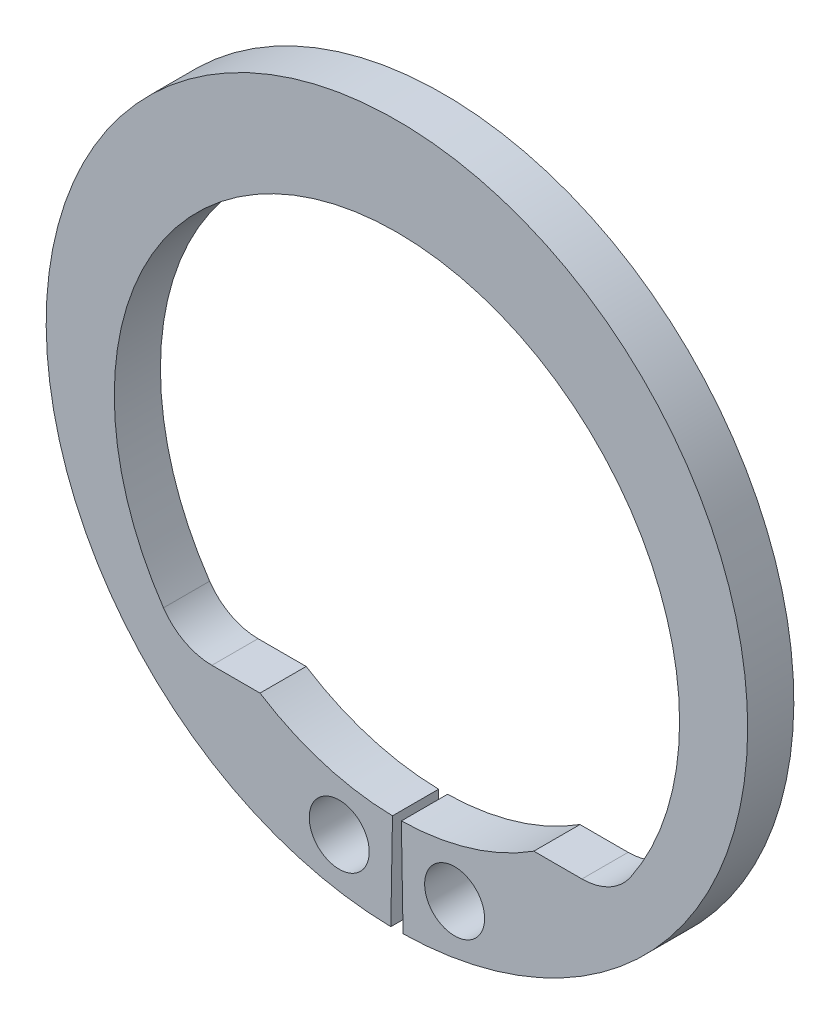
ISO-10303-21;
HEADER;
FILE_DESCRIPTION(('STEP AP214'),'2;1');
FILE_NAME('part.step','',(''),(''),'','','');
FILE_SCHEMA(('AUTOMOTIVE_DESIGN { 1 0 10303 214 1 1 1 1 }'));
ENDSEC;
DATA;
#1=APPLICATION_CONTEXT('core data for automotive mechanical design processes');
#2=APPLICATION_PROTOCOL_DEFINITION('international standard','automotive_design',2000,#1);
#3=PRODUCT_CONTEXT('',#1,'mechanical');
#4=PRODUCT('Part','Part','',(#3));
#5=PRODUCT_RELATED_PRODUCT_CATEGORY('part','',(#4));
#6=PRODUCT_DEFINITION_FORMATION('','',#4);
#7=PRODUCT_DEFINITION_CONTEXT('part definition',#1,'design');
#8=PRODUCT_DEFINITION('design','',#6,#7);
#9=PRODUCT_DEFINITION_SHAPE('','',#8);
#10=(LENGTH_UNIT() NAMED_UNIT(*) SI_UNIT(.MILLI.,.METRE.));
#11=(NAMED_UNIT(*) PLANE_ANGLE_UNIT() SI_UNIT($,.RADIAN.));
#12=(NAMED_UNIT(*) SI_UNIT($,.STERADIAN.) SOLID_ANGLE_UNIT());
#13=UNCERTAINTY_MEASURE_WITH_UNIT(LENGTH_MEASURE(1.E-05),#10,'distance_accuracy_value','');
#14=(GEOMETRIC_REPRESENTATION_CONTEXT(3) GLOBAL_UNCERTAINTY_ASSIGNED_CONTEXT((#13)) GLOBAL_UNIT_ASSIGNED_CONTEXT((#10,
#11,#12)) REPRESENTATION_CONTEXT('',''));
#15=CARTESIAN_POINT('',(0.,0.,0.));
#16=DIRECTION('',(0.,0.,1.));
#17=DIRECTION('',(1.,0.,0.));
#18=AXIS2_PLACEMENT_3D('',#15,#16,#17);
#19=CARTESIAN_POINT('',(0.,0.,0.5));
#20=DIRECTION('',(0.,0.,1.));
#21=DIRECTION('',(1.,0.,0.));
#22=AXIS2_PLACEMENT_3D('',#19,#20,#21);
#23=PLANE('',#22);
#24=CARTESIAN_POINT('',(0.,0.,0.5));
#25=DIRECTION('',(0.,0.,-1.));
#26=DIRECTION('',(1.,0.,0.));
#27=AXIS2_PLACEMENT_3D('',#24,#25,#26);
#28=CIRCLE('',#27,5.5);
#29=CARTESIAN_POINT('',(-0.0959882354050588,-5.49916232336015,0.5));
#30=VERTEX_POINT('',#29);
#31=CARTESIAN_POINT('',(-2.96626869989887,-4.63154941677191,0.5));
#32=VERTEX_POINT('',#31);
#33=EDGE_CURVE('E170',#30,#32,#28,.T.);
#34=ORIENTED_EDGE('',*,*,#33,.T.);
#35=DIRECTION('',(-1.,0.,0.));
#36=VECTOR('',#35,1.);
#37=CARTESIAN_POINT('',(-2.96626869989887,-4.63154941677191,0.5));
#38=LINE('',#37,#36);
#39=CARTESIAN_POINT('',(-4.00916176916149,-4.63154941677191,0.5));
#40=VERTEX_POINT('',#39);
#41=EDGE_CURVE('E172',#32,#40,#38,.T.);
#42=ORIENTED_EDGE('',*,*,#41,.T.);
#43=CARTESIAN_POINT('',(-4.00916176916149,-3.36154941677191,0.5));
#44=DIRECTION('',(0.,0.,1.));
#45=DIRECTION('',(1.,0.,0.));
#46=AXIS2_PLACEMENT_3D('',#43,#44,#45);
#47=CIRCLE('',#46,1.27);
#48=CARTESIAN_POINT('',(-5.05802960097574,-4.07763340024401,0.5));
#49=VERTEX_POINT('',#48);
#50=EDGE_CURVE('E11',#40,#49,#47,.F.);
#51=ORIENTED_EDGE('',*,*,#50,.T.);
#52=CARTESIAN_POINT('',(0.,-0.624410910884708,0.5));
#53=DIRECTION('',(0.,0.,-1.));
#54=DIRECTION('',(-1.,0.,0.));
#55=AXIS2_PLACEMENT_3D('',#52,#53,#54);
#56=CIRCLE('',#55,6.12441091088471);
#57=CARTESIAN_POINT('',(5.05802960097574,-4.07763340024401,0.5));
#58=VERTEX_POINT('',#57);
#59=EDGE_CURVE('E175',#49,#58,#56,.T.);
#60=ORIENTED_EDGE('',*,*,#59,.T.);
#61=CARTESIAN_POINT('',(4.00916176916149,-3.36154941677191,0.5));
#62=DIRECTION('',(0.,0.,-1.));
#63=DIRECTION('',(-1.,0.,0.));
#64=AXIS2_PLACEMENT_3D('',#61,#62,#63);
#65=CIRCLE('',#64,1.27);
#66=CARTESIAN_POINT('',(4.00916176916149,-4.63154941677191,0.5));
#67=VERTEX_POINT('',#66);
#68=EDGE_CURVE('E133',#67,#58,#65,.F.);
#69=ORIENTED_EDGE('',*,*,#68,.F.);
#70=DIRECTION('',(1.,0.,0.));
#71=VECTOR('',#70,1.);
#72=CARTESIAN_POINT('',(2.96626869989887,-4.63154941677191,0.5));
#73=LINE('',#72,#71);
#74=CARTESIAN_POINT('',(2.96626869989887,-4.63154941677191,0.5));
#75=VERTEX_POINT('',#74);
#76=EDGE_CURVE('E115',#75,#67,#73,.T.);
#77=ORIENTED_EDGE('',*,*,#76,.F.);
#78=CARTESIAN_POINT('',(0.,0.,0.5));
#79=DIRECTION('',(0.,0.,1.));
#80=DIRECTION('',(-1.,0.,0.));
#81=AXIS2_PLACEMENT_3D('',#78,#79,#80);
#82=CIRCLE('',#81,5.5);
#83=CARTESIAN_POINT('',(0.0959882354050588,-5.49916232336015,0.5));
#84=VERTEX_POINT('',#83);
#85=EDGE_CURVE('E131',#84,#75,#82,.T.);
#86=ORIENTED_EDGE('',*,*,#85,.F.);
#87=DIRECTION('',(-0.0174524064372834,0.999847695156391,0.));
#88=VECTOR('',#87,1.);
#89=CARTESIAN_POINT('',(0.0959882354050588,-5.49916232336015,0.5));
#90=LINE('',#89,#88);
#91=CARTESIAN_POINT('',(0.132638288923355,-7.59884248318857,0.5));
#92=VERTEX_POINT('',#91);
#93=EDGE_CURVE('E134',#92,#84,#90,.T.);
#94=ORIENTED_EDGE('',*,*,#93,.F.);
#95=CARTESIAN_POINT('',(0.,0.,0.5));
#96=DIRECTION('',(0.,0.,1.));
#97=DIRECTION('',(1.,0.,0.));
#98=AXIS2_PLACEMENT_3D('',#95,#96,#97);
#99=CIRCLE('',#98,7.6);
#100=CARTESIAN_POINT('',(-0.132638288923355,-7.59884248318857,0.5));
#101=VERTEX_POINT('',#100);
#102=EDGE_CURVE('E177',#92,#101,#99,.T.);
#103=ORIENTED_EDGE('',*,*,#102,.T.);
#104=DIRECTION('',(0.0174524064372834,0.999847695156391,0.));
#105=VECTOR('',#104,1.);
#106=CARTESIAN_POINT('',(-0.0959882354050588,-5.49916232336015,0.5));
#107=LINE('',#106,#105);
#108=EDGE_CURVE('E179',#101,#30,#107,.T.);
#109=ORIENTED_EDGE('',*,*,#108,.T.);
#110=EDGE_LOOP('',(#34,#42,#51,#60,#69,#77,#86,#94,#103,#109));
#111=FACE_BOUND('',#110,.T.);
#112=CARTESIAN_POINT('',(-1.24979891971637,-6.4296580515822,0.5));
#113=DIRECTION('',(0.,0.,1.));
#114=DIRECTION('',(1.,0.,0.));
#115=AXIS2_PLACEMENT_3D('',#112,#113,#114);
#116=CIRCLE('',#115,0.65);
#117=CARTESIAN_POINT('',(-0.59979891971637,-6.4296580515822,0.5));
#118=VERTEX_POINT('',#117);
#119=EDGE_CURVE('E164',#118,#118,#116,.T.);
#120=ORIENTED_EDGE('',*,*,#119,.F.);
#121=EDGE_LOOP('',(#120));
#122=FACE_BOUND('',#121,.T.);
#123=CARTESIAN_POINT('',(1.24979891971637,-6.4296580515822,0.5));
#124=DIRECTION('',(0.,0.,-1.));
#125=DIRECTION('',(-1.,0.,0.));
#126=AXIS2_PLACEMENT_3D('',#123,#124,#125);
#127=CIRCLE('',#126,0.65);
#128=CARTESIAN_POINT('',(0.59979891971637,-6.4296580515822,0.5));
#129=VERTEX_POINT('',#128);
#130=EDGE_CURVE('E150',#129,#129,#127,.T.);
#131=ORIENTED_EDGE('',*,*,#130,.T.);
#132=EDGE_LOOP('',(#131));
#133=FACE_BOUND('',#132,.T.);
#134=ADVANCED_FACE('F37',(#111,#122,#133),#23,.T.);
#135=CARTESIAN_POINT('',(0.,0.,-0.5));
#136=DIRECTION('',(0.,0.,1.));
#137=DIRECTION('',(1.,0.,0.));
#138=AXIS2_PLACEMENT_3D('',#135,#136,#137);
#139=PLANE('',#138);
#140=CARTESIAN_POINT('',(0.,0.,-0.5));
#141=DIRECTION('',(0.,0.,-1.));
#142=DIRECTION('',(1.,0.,0.));
#143=AXIS2_PLACEMENT_3D('',#140,#141,#142);
#144=CIRCLE('',#143,5.5);
#145=CARTESIAN_POINT('',(-0.0959882354050588,-5.49916232336015,-0.5));
#146=VERTEX_POINT('',#145);
#147=CARTESIAN_POINT('',(-2.96626869989887,-4.63154941677191,-0.5));
#148=VERTEX_POINT('',#147);
#149=EDGE_CURVE('E167',#146,#148,#144,.T.);
#150=ORIENTED_EDGE('',*,*,#149,.F.);
#151=DIRECTION('',(0.0174524064372834,0.999847695156391,0.));
#152=VECTOR('',#151,1.);
#153=CARTESIAN_POINT('',(-0.0959882354050588,-5.49916232336015,-0.5));
#154=LINE('',#153,#152);
#155=CARTESIAN_POINT('',(-0.132638288923355,-7.59884248318857,-0.5));
#156=VERTEX_POINT('',#155);
#157=EDGE_CURVE('E173',#156,#146,#154,.T.);
#158=ORIENTED_EDGE('',*,*,#157,.F.);
#159=CARTESIAN_POINT('',(0.,0.,-0.5));
#160=DIRECTION('',(0.,0.,1.));
#161=DIRECTION('',(1.,0.,0.));
#162=AXIS2_PLACEMENT_3D('',#159,#160,#161);
#163=CIRCLE('',#162,7.6);
#164=CARTESIAN_POINT('',(0.132638288923355,-7.59884248318857,-0.5));
#165=VERTEX_POINT('',#164);
#166=EDGE_CURVE('E188',#165,#156,#163,.T.);
#167=ORIENTED_EDGE('',*,*,#166,.F.);
#168=DIRECTION('',(-0.0174524064372834,0.999847695156391,0.));
#169=VECTOR('',#168,1.);
#170=CARTESIAN_POINT('',(0.0959882354050588,-5.49916232336015,-0.5));
#171=LINE('',#170,#169);
#172=CARTESIAN_POINT('',(0.0959882354050588,-5.49916232336015,-0.5));
#173=VERTEX_POINT('',#172);
#174=EDGE_CURVE('E139',#165,#173,#171,.T.);
#175=ORIENTED_EDGE('',*,*,#174,.T.);
#176=CARTESIAN_POINT('',(0.,0.,-0.5));
#177=DIRECTION('',(0.,0.,1.));
#178=DIRECTION('',(-1.,0.,0.));
#179=AXIS2_PLACEMENT_3D('',#176,#177,#178);
#180=CIRCLE('',#179,5.5);
#181=CARTESIAN_POINT('',(2.96626869989887,-4.63154941677191,-0.5));
#182=VERTEX_POINT('',#181);
#183=EDGE_CURVE('E148',#173,#182,#180,.T.);
#184=ORIENTED_EDGE('',*,*,#183,.T.);
#185=DIRECTION('',(1.,0.,0.));
#186=VECTOR('',#185,1.);
#187=CARTESIAN_POINT('',(2.96626869989887,-4.63154941677191,-0.5));
#188=LINE('',#187,#186);
#189=CARTESIAN_POINT('',(4.00916176916149,-4.63154941677191,-0.5));
#190=VERTEX_POINT('',#189);
#191=EDGE_CURVE('E118',#182,#190,#188,.T.);
#192=ORIENTED_EDGE('',*,*,#191,.T.);
#193=CARTESIAN_POINT('',(4.00916176916149,-3.36154941677191,-0.5));
#194=DIRECTION('',(0.,0.,-1.));
#195=DIRECTION('',(-1.,0.,0.));
#196=AXIS2_PLACEMENT_3D('',#193,#194,#195);
#197=CIRCLE('',#196,1.27);
#198=CARTESIAN_POINT('',(5.05802960097574,-4.07763340024401,-0.5));
#199=VERTEX_POINT('',#198);
#200=EDGE_CURVE('E159',#199,#190,#197,.T.);
#201=ORIENTED_EDGE('',*,*,#200,.F.);
#202=CARTESIAN_POINT('',(0.,-0.624410910884708,-0.5));
#203=DIRECTION('',(0.,0.,-1.));
#204=DIRECTION('',(-1.,0.,0.));
#205=AXIS2_PLACEMENT_3D('',#202,#203,#204);
#206=CIRCLE('',#205,6.12441091088471);
#207=CARTESIAN_POINT('',(-5.05802960097574,-4.07763340024401,-0.5));
#208=VERTEX_POINT('',#207);
#209=EDGE_CURVE('E186',#208,#199,#206,.T.);
#210=ORIENTED_EDGE('',*,*,#209,.F.);
#211=CARTESIAN_POINT('',(-4.00916176916149,-3.36154941677191,-0.5));
#212=DIRECTION('',(0.,0.,1.));
#213=DIRECTION('',(1.,0.,0.));
#214=AXIS2_PLACEMENT_3D('',#211,#212,#213);
#215=CIRCLE('',#214,1.27);
#216=CARTESIAN_POINT('',(-4.00916176916149,-4.63154941677191,-0.5));
#217=VERTEX_POINT('',#216);
#218=EDGE_CURVE('E45',#208,#217,#215,.T.);
#219=ORIENTED_EDGE('',*,*,#218,.T.);
#220=DIRECTION('',(-1.,0.,0.));
#221=VECTOR('',#220,1.);
#222=CARTESIAN_POINT('',(-2.96626869989887,-4.63154941677191,-0.5));
#223=LINE('',#222,#221);
#224=EDGE_CURVE('E184',#148,#217,#223,.T.);
#225=ORIENTED_EDGE('',*,*,#224,.F.);
#226=EDGE_LOOP('',(#150,#158,#167,#175,#184,#192,#201,#210,#219,#225));
#227=FACE_BOUND('',#226,.T.);
#228=CARTESIAN_POINT('',(-1.24979891971637,-6.4296580515822,-0.5));
#229=DIRECTION('',(0.,0.,1.));
#230=DIRECTION('',(1.,0.,0.));
#231=AXIS2_PLACEMENT_3D('',#228,#229,#230);
#232=CIRCLE('',#231,0.65);
#233=CARTESIAN_POINT('',(-0.59979891971637,-6.4296580515822,-0.5));
#234=VERTEX_POINT('',#233);
#235=EDGE_CURVE('E163',#234,#234,#232,.T.);
#236=ORIENTED_EDGE('',*,*,#235,.T.);
#237=EDGE_LOOP('',(#236));
#238=FACE_BOUND('',#237,.T.);
#239=CARTESIAN_POINT('',(1.24979891971637,-6.4296580515822,-0.5));
#240=DIRECTION('',(0.,0.,-1.));
#241=DIRECTION('',(-1.,0.,0.));
#242=AXIS2_PLACEMENT_3D('',#239,#240,#241);
#243=CIRCLE('',#242,0.65);
#244=CARTESIAN_POINT('',(0.59979891971637,-6.4296580515822,-0.5));
#245=VERTEX_POINT('',#244);
#246=EDGE_CURVE('E144',#245,#245,#243,.T.);
#247=ORIENTED_EDGE('',*,*,#246,.F.);
#248=EDGE_LOOP('',(#247));
#249=FACE_BOUND('',#248,.T.);
#250=ADVANCED_FACE('F211',(#227,#238,#249),#139,.F.);
#251=CARTESIAN_POINT('',(0.,0.,0.5));
#252=DIRECTION('',(0.,0.,-1.));
#253=DIRECTION('',(-1.,0.,0.));
#254=AXIS2_PLACEMENT_3D('',#251,#252,#253);
#255=CYLINDRICAL_SURFACE('',#254,5.5);
#256=ORIENTED_EDGE('',*,*,#149,.T.);
#257=DIRECTION('',(0.,0.,-1.));
#258=VECTOR('',#257,1.);
#259=CARTESIAN_POINT('',(-2.96626869989887,-4.63154941677191,0.5));
#260=LINE('',#259,#258);
#261=EDGE_CURVE('E196',#32,#148,#260,.T.);
#262=ORIENTED_EDGE('',*,*,#261,.F.);
#263=ORIENTED_EDGE('',*,*,#33,.F.);
#264=DIRECTION('',(0.,0.,-1.));
#265=VECTOR('',#264,1.);
#266=CARTESIAN_POINT('',(-0.0959882354050588,-5.49916232336015,0.5));
#267=LINE('',#266,#265);
#268=EDGE_CURVE('E181',#30,#146,#267,.T.);
#269=ORIENTED_EDGE('',*,*,#268,.T.);
#270=EDGE_LOOP('',(#256,#262,#263,#269));
#271=FACE_BOUND('',#270,.T.);
#272=ADVANCED_FACE('F232',(#271),#255,.F.);
#273=CARTESIAN_POINT('',(-2.96626869989887,-4.63154941677191,0.5));
#274=DIRECTION('',(0.,-1.,0.));
#275=DIRECTION('',(0.,0.,-1.));
#276=AXIS2_PLACEMENT_3D('',#273,#274,#275);
#277=PLANE('',#276);
#278=ORIENTED_EDGE('',*,*,#224,.T.);
#279=DIRECTION('',(0.,0.,1.));
#280=VECTOR('',#279,1.);
#281=CARTESIAN_POINT('',(-4.00916176916149,-4.63154941677191,0.5));
#282=LINE('',#281,#280);
#283=EDGE_CURVE('E52',#217,#40,#282,.T.);
#284=ORIENTED_EDGE('',*,*,#283,.T.);
#285=ORIENTED_EDGE('',*,*,#41,.F.);
#286=ORIENTED_EDGE('',*,*,#261,.T.);
#287=EDGE_LOOP('',(#278,#284,#285,#286));
#288=FACE_BOUND('',#287,.T.);
#289=ADVANCED_FACE('F246',(#288),#277,.F.);
#290=CARTESIAN_POINT('',(0.,-0.624410910884708,0.5));
#291=DIRECTION('',(0.,0.,-1.));
#292=DIRECTION('',(-1.,0.,0.));
#293=AXIS2_PLACEMENT_3D('',#290,#291,#292);
#294=CYLINDRICAL_SURFACE('',#293,6.12441091088471);
#295=ORIENTED_EDGE('',*,*,#59,.F.);
#296=DIRECTION('',(0.,0.,-1.));
#297=VECTOR('',#296,1.);
#298=CARTESIAN_POINT('',(-5.05802960097574,-4.07763340024401,0.5));
#299=LINE('',#298,#297);
#300=EDGE_CURVE('E199',#49,#208,#299,.T.);
#301=ORIENTED_EDGE('',*,*,#300,.T.);
#302=ORIENTED_EDGE('',*,*,#209,.T.);
#303=DIRECTION('',(0.,0.,-1.));
#304=VECTOR('',#303,1.);
#305=CARTESIAN_POINT('',(5.05802960097574,-4.07763340024401,0.5));
#306=LINE('',#305,#304);
#307=EDGE_CURVE('E123',#58,#199,#306,.T.);
#308=ORIENTED_EDGE('',*,*,#307,.F.);
#309=EDGE_LOOP('',(#295,#301,#302,#308));
#310=FACE_BOUND('',#309,.T.);
#311=ADVANCED_FACE('F205',(#310),#294,.F.);
#312=CARTESIAN_POINT('',(0.,0.,0.5));
#313=DIRECTION('',(0.,0.,-1.));
#314=DIRECTION('',(-1.,0.,0.));
#315=AXIS2_PLACEMENT_3D('',#312,#313,#314);
#316=CYLINDRICAL_SURFACE('',#315,7.6);
#317=ORIENTED_EDGE('',*,*,#166,.T.);
#318=DIRECTION('',(0.,0.,-1.));
#319=VECTOR('',#318,1.);
#320=CARTESIAN_POINT('',(-0.132638288923355,-7.59884248318857,0.5));
#321=LINE('',#320,#319);
#322=EDGE_CURVE('E193',#101,#156,#321,.T.);
#323=ORIENTED_EDGE('',*,*,#322,.F.);
#324=ORIENTED_EDGE('',*,*,#102,.F.);
#325=DIRECTION('',(0.,0.,-1.));
#326=VECTOR('',#325,1.);
#327=CARTESIAN_POINT('',(0.132638288923355,-7.59884248318857,0.5));
#328=LINE('',#327,#326);
#329=EDGE_CURVE('E124',#92,#165,#328,.T.);
#330=ORIENTED_EDGE('',*,*,#329,.T.);
#331=EDGE_LOOP('',(#317,#323,#324,#330));
#332=FACE_BOUND('',#331,.T.);
#333=ADVANCED_FACE('F239',(#332),#316,.T.);
#334=CARTESIAN_POINT('',(-0.0959882354050588,-5.49916232336015,0.5));
#335=DIRECTION('',(-0.999847695156391,0.0174524064372834,0.));
#336=DIRECTION('',(-0.0174524064372834,-0.999847695156391,0.));
#337=AXIS2_PLACEMENT_3D('',#334,#335,#336);
#338=PLANE('',#337);
#339=ORIENTED_EDGE('',*,*,#157,.T.);
#340=ORIENTED_EDGE('',*,*,#268,.F.);
#341=ORIENTED_EDGE('',*,*,#108,.F.);
#342=ORIENTED_EDGE('',*,*,#322,.T.);
#343=EDGE_LOOP('',(#339,#340,#341,#342));
#344=FACE_BOUND('',#343,.T.);
#345=ADVANCED_FACE('F236',(#344),#338,.F.);
#346=CARTESIAN_POINT('',(-1.24979891971637,-6.4296580515822,0.5));
#347=DIRECTION('',(0.,0.,-1.));
#348=DIRECTION('',(-1.,0.,0.));
#349=AXIS2_PLACEMENT_3D('',#346,#347,#348);
#350=CYLINDRICAL_SURFACE('',#349,0.65);
#351=ORIENTED_EDGE('',*,*,#119,.T.);
#352=EDGE_LOOP('',(#351));
#353=FACE_BOUND('',#352,.T.);
#354=ORIENTED_EDGE('',*,*,#235,.F.);
#355=EDGE_LOOP('',(#354));
#356=FACE_BOUND('',#355,.T.);
#357=ADVANCED_FACE('F234',(#353,#356),#350,.F.);
#358=CARTESIAN_POINT('',(-4.00916176916149,-3.36154941677191,0.5));
#359=DIRECTION('',(0.,0.,-1.));
#360=DIRECTION('',(-1.,0.,0.));
#361=AXIS2_PLACEMENT_3D('',#358,#359,#360);
#362=CYLINDRICAL_SURFACE('',#361,1.27);
#363=ORIENTED_EDGE('',*,*,#50,.F.);
#364=ORIENTED_EDGE('',*,*,#283,.F.);
#365=ORIENTED_EDGE('',*,*,#218,.F.);
#366=ORIENTED_EDGE('',*,*,#300,.F.);
#367=EDGE_LOOP('',(#363,#364,#365,#366));
#368=FACE_BOUND('',#367,.T.);
#369=ADVANCED_FACE('F39',(#368),#362,.F.);
#370=CARTESIAN_POINT('',(0.,0.,0.5));
#371=DIRECTION('',(0.,0.,-1.));
#372=DIRECTION('',(1.,0.,0.));
#373=AXIS2_PLACEMENT_3D('',#370,#371,#372);
#374=CYLINDRICAL_SURFACE('',#373,5.5);
#375=ORIENTED_EDGE('',*,*,#183,.F.);
#376=DIRECTION('',(0.,0.,-1.));
#377=VECTOR('',#376,1.);
#378=CARTESIAN_POINT('',(0.0959882354050588,-5.49916232336015,0.5));
#379=LINE('',#378,#377);
#380=EDGE_CURVE('E137',#84,#173,#379,.T.);
#381=ORIENTED_EDGE('',*,*,#380,.F.);
#382=ORIENTED_EDGE('',*,*,#85,.T.);
#383=DIRECTION('',(0.,0.,-1.));
#384=VECTOR('',#383,1.);
#385=CARTESIAN_POINT('',(2.96626869989887,-4.63154941677191,0.5));
#386=LINE('',#385,#384);
#387=EDGE_CURVE('E112',#75,#182,#386,.T.);
#388=ORIENTED_EDGE('',*,*,#387,.T.);
#389=EDGE_LOOP('',(#375,#381,#382,#388));
#390=FACE_BOUND('',#389,.T.);
#391=ADVANCED_FACE('F136',(#390),#374,.F.);
#392=CARTESIAN_POINT('',(2.96626869989887,-4.63154941677191,0.5));
#393=DIRECTION('',(0.,-1.,0.));
#394=DIRECTION('',(0.,0.,-1.));
#395=AXIS2_PLACEMENT_3D('',#392,#393,#394);
#396=PLANE('',#395);
#397=ORIENTED_EDGE('',*,*,#191,.F.);
#398=ORIENTED_EDGE('',*,*,#387,.F.);
#399=ORIENTED_EDGE('',*,*,#76,.T.);
#400=DIRECTION('',(0.,0.,1.));
#401=VECTOR('',#400,1.);
#402=CARTESIAN_POINT('',(4.00916176916149,-4.63154941677191,0.5));
#403=LINE('',#402,#401);
#404=EDGE_CURVE('E157',#190,#67,#403,.T.);
#405=ORIENTED_EDGE('',*,*,#404,.F.);
#406=EDGE_LOOP('',(#397,#398,#399,#405));
#407=FACE_BOUND('',#406,.T.);
#408=ADVANCED_FACE('F114',(#407),#396,.F.);
#409=CARTESIAN_POINT('',(0.0959882354050588,-5.49916232336015,0.5));
#410=DIRECTION('',(0.999847695156391,0.0174524064372834,0.));
#411=DIRECTION('',(0.0174524064372834,-0.999847695156391,0.));
#412=AXIS2_PLACEMENT_3D('',#409,#410,#411);
#413=PLANE('',#412);
#414=ORIENTED_EDGE('',*,*,#174,.F.);
#415=ORIENTED_EDGE('',*,*,#329,.F.);
#416=ORIENTED_EDGE('',*,*,#93,.T.);
#417=ORIENTED_EDGE('',*,*,#380,.T.);
#418=EDGE_LOOP('',(#414,#415,#416,#417));
#419=FACE_BOUND('',#418,.T.);
#420=ADVANCED_FACE('F221',(#419),#413,.F.);
#421=CARTESIAN_POINT('',(1.24979891971637,-6.4296580515822,0.5));
#422=DIRECTION('',(0.,0.,-1.));
#423=DIRECTION('',(1.,0.,0.));
#424=AXIS2_PLACEMENT_3D('',#421,#422,#423);
#425=CYLINDRICAL_SURFACE('',#424,0.65);
#426=ORIENTED_EDGE('',*,*,#130,.F.);
#427=EDGE_LOOP('',(#426));
#428=FACE_BOUND('',#427,.T.);
#429=ORIENTED_EDGE('',*,*,#246,.T.);
#430=EDGE_LOOP('',(#429));
#431=FACE_BOUND('',#430,.T.);
#432=ADVANCED_FACE('F216',(#428,#431),#425,.F.);
#433=CARTESIAN_POINT('',(4.00916176916149,-3.36154941677191,0.5));
#434=DIRECTION('',(0.,0.,-1.));
#435=DIRECTION('',(1.,0.,0.));
#436=AXIS2_PLACEMENT_3D('',#433,#434,#435);
#437=CYLINDRICAL_SURFACE('',#436,1.27);
#438=ORIENTED_EDGE('',*,*,#68,.T.);
#439=ORIENTED_EDGE('',*,*,#307,.T.);
#440=ORIENTED_EDGE('',*,*,#200,.T.);
#441=ORIENTED_EDGE('',*,*,#404,.T.);
#442=EDGE_LOOP('',(#438,#439,#440,#441));
#443=FACE_BOUND('',#442,.T.);
#444=ADVANCED_FACE('F214',(#443),#437,.F.);
#445=CLOSED_SHELL('',(#134,#250,#272,#289,#311,#333,#345,#357,#369,#391,#408,#420,#432,#444));
#446=MANIFOLD_SOLID_BREP('B2',#445);
#447=ADVANCED_BREP_SHAPE_REPRESENTATION('',(#18,#446),#14);
#448=SHAPE_DEFINITION_REPRESENTATION(#9,#447);
ENDSEC;
END-ISO-10303-21;
